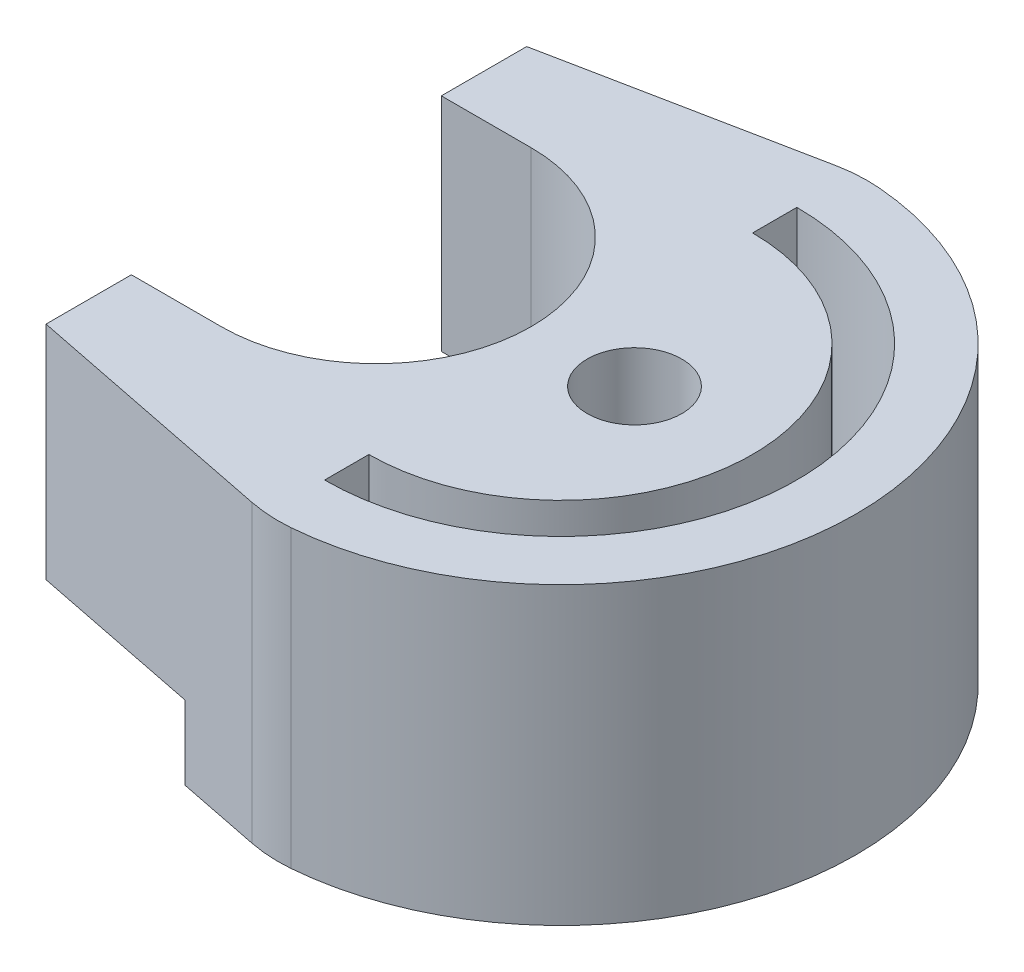
ISO-10303-21;
HEADER;
FILE_DESCRIPTION(('STEP AP214'),'2;1');
FILE_NAME('part.step','',(''),(''),'','','');
FILE_SCHEMA(('AUTOMOTIVE_DESIGN { 1 0 10303 214 1 1 1 1 }'));
ENDSEC;
DATA;
#1=APPLICATION_CONTEXT('core data for automotive mechanical design processes');
#2=APPLICATION_PROTOCOL_DEFINITION('international standard','automotive_design',2000,#1);
#3=PRODUCT_CONTEXT('',#1,'mechanical');
#4=PRODUCT('Part','Part','',(#3));
#5=PRODUCT_RELATED_PRODUCT_CATEGORY('part','',(#4));
#6=PRODUCT_DEFINITION_FORMATION('','',#4);
#7=PRODUCT_DEFINITION_CONTEXT('part definition',#1,'design');
#8=PRODUCT_DEFINITION('design','',#6,#7);
#9=PRODUCT_DEFINITION_SHAPE('','',#8);
#10=(LENGTH_UNIT() NAMED_UNIT(*) SI_UNIT(.MILLI.,.METRE.));
#11=(NAMED_UNIT(*) PLANE_ANGLE_UNIT() SI_UNIT($,.RADIAN.));
#12=(NAMED_UNIT(*) SI_UNIT($,.STERADIAN.) SOLID_ANGLE_UNIT());
#13=UNCERTAINTY_MEASURE_WITH_UNIT(LENGTH_MEASURE(1.E-05),#10,'distance_accuracy_value','');
#14=(GEOMETRIC_REPRESENTATION_CONTEXT(3) GLOBAL_UNCERTAINTY_ASSIGNED_CONTEXT((#13)) GLOBAL_UNIT_ASSIGNED_CONTEXT((#10,
#11,#12)) REPRESENTATION_CONTEXT('',''));
#15=CARTESIAN_POINT('',(0.,0.,0.));
#16=DIRECTION('',(0.,0.,1.));
#17=DIRECTION('',(1.,0.,0.));
#18=AXIS2_PLACEMENT_3D('',#15,#16,#17);
#19=CARTESIAN_POINT('',(-0.681941879985558,2.,0.));
#20=DIRECTION('',(-1.,0.,0.));
#21=DIRECTION('',(0.,0.,1.));
#22=AXIS2_PLACEMENT_3D('',#19,#20,#21);
#23=PLANE('',#22);
#24=DIRECTION('',(0.,-1.,0.));
#25=VECTOR('',#24,1.);
#26=CARTESIAN_POINT('',(-0.681941879985558,2.,-1.11346754433403));
#27=LINE('',#26,#25);
#28=CARTESIAN_POINT('',(-0.681941879985558,0.5,-1.11346754433403));
#29=VERTEX_POINT('',#28);
#30=CARTESIAN_POINT('',(-0.681941879985558,0.,-1.11346754433403));
#31=VERTEX_POINT('',#30);
#32=EDGE_CURVE('E303',#29,#31,#27,.T.);
#33=ORIENTED_EDGE('',*,*,#32,.F.);
#34=DIRECTION('',(0.,0.,1.));
#35=VECTOR('',#34,1.);
#36=CARTESIAN_POINT('',(-0.681941879985558,0.5,0.));
#37=LINE('',#36,#35);
#38=CARTESIAN_POINT('',(-0.681941879985558,0.5,-1.86374319751422));
#39=VERTEX_POINT('',#38);
#40=EDGE_CURVE('E54',#39,#29,#37,.T.);
#41=ORIENTED_EDGE('',*,*,#40,.F.);
#42=DIRECTION('',(0.,-1.,0.));
#43=VECTOR('',#42,1.);
#44=CARTESIAN_POINT('',(-0.681941879985558,2.,-1.86374319751422));
#45=LINE('',#44,#43);
#46=CARTESIAN_POINT('',(-0.681941879985558,0.,-1.86374319751422));
#47=VERTEX_POINT('',#46);
#48=EDGE_CURVE('E305',#39,#47,#45,.T.);
#49=ORIENTED_EDGE('',*,*,#48,.T.);
#50=DIRECTION('',(0.,0.,-1.));
#51=VECTOR('',#50,1.);
#52=CARTESIAN_POINT('',(-0.681941879985558,0.,0.));
#53=LINE('',#52,#51);
#54=EDGE_CURVE('E281',#31,#47,#53,.T.);
#55=ORIENTED_EDGE('',*,*,#54,.F.);
#56=EDGE_LOOP('',(#33,#41,#49,#55));
#57=FACE_BOUND('',#56,.T.);
#58=ADVANCED_FACE('F37',(#57),#23,.T.);
#59=CARTESIAN_POINT('',(-1.24999999999968,2.,0.));
#60=DIRECTION('',(0.,-1.,0.));
#61=DIRECTION('',(0.,0.,-1.));
#62=AXIS2_PLACEMENT_3D('',#59,#60,#61);
#63=CYLINDRICAL_SURFACE('',#62,1.24999999999969);
#64=DIRECTION('',(0.,-1.,0.));
#65=VECTOR('',#64,1.);
#66=CARTESIAN_POINT('',(-0.681941879985558,2.,1.11346754433402));
#67=LINE('',#66,#65);
#68=CARTESIAN_POINT('',(-0.681941879985558,0.5,1.11346754433402));
#69=VERTEX_POINT('',#68);
#70=CARTESIAN_POINT('',(-0.681941879985558,0.,1.11346754433402));
#71=VERTEX_POINT('',#70);
#72=EDGE_CURVE('E301',#69,#71,#67,.T.);
#73=ORIENTED_EDGE('',*,*,#72,.F.);
#74=CARTESIAN_POINT('',(-1.24999999999968,0.5,0.));
#75=DIRECTION('',(0.,1.,0.));
#76=DIRECTION('',(0.,0.,1.));
#77=AXIS2_PLACEMENT_3D('',#74,#75,#76);
#78=CIRCLE('',#77,1.24999999999969);
#79=EDGE_CURVE('E62',#69,#29,#78,.T.);
#80=ORIENTED_EDGE('',*,*,#79,.T.);
#81=ORIENTED_EDGE('',*,*,#32,.T.);
#82=CARTESIAN_POINT('',(-1.24999999999968,0.,0.));
#83=DIRECTION('',(0.,1.,0.));
#84=DIRECTION('',(0.,0.,1.));
#85=AXIS2_PLACEMENT_3D('',#82,#83,#84);
#86=CIRCLE('',#85,1.24999999999969);
#87=EDGE_CURVE('E284',#71,#31,#86,.T.);
#88=ORIENTED_EDGE('',*,*,#87,.F.);
#89=EDGE_LOOP('',(#73,#80,#81,#88));
#90=FACE_BOUND('',#89,.T.);
#91=ADVANCED_FACE('F362',(#90),#63,.F.);
#92=CARTESIAN_POINT('',(-0.681941879985558,2.,0.));
#93=DIRECTION('',(-1.,0.,0.));
#94=DIRECTION('',(0.,0.,1.));
#95=AXIS2_PLACEMENT_3D('',#92,#93,#94);
#96=PLANE('',#95);
#97=DIRECTION('',(0.,-1.,0.));
#98=VECTOR('',#97,1.);
#99=CARTESIAN_POINT('',(-0.681941879985558,2.,1.86374319742319));
#100=LINE('',#99,#98);
#101=CARTESIAN_POINT('',(-0.681941879985558,0.5,1.86374319742319));
#102=VERTEX_POINT('',#101);
#103=CARTESIAN_POINT('',(-0.681941879985558,0.,1.86374319742319));
#104=VERTEX_POINT('',#103);
#105=EDGE_CURVE('E299',#102,#104,#100,.T.);
#106=ORIENTED_EDGE('',*,*,#105,.F.);
#107=DIRECTION('',(0.,0.,1.));
#108=VECTOR('',#107,1.);
#109=CARTESIAN_POINT('',(-0.681941879985558,0.5,0.));
#110=LINE('',#109,#108);
#111=EDGE_CURVE('E209',#69,#102,#110,.T.);
#112=ORIENTED_EDGE('',*,*,#111,.F.);
#113=ORIENTED_EDGE('',*,*,#72,.T.);
#114=DIRECTION('',(0.,0.,-1.));
#115=VECTOR('',#114,1.);
#116=CARTESIAN_POINT('',(-0.681941879985558,0.,0.));
#117=LINE('',#116,#115);
#118=EDGE_CURVE('E287',#104,#71,#117,.T.);
#119=ORIENTED_EDGE('',*,*,#118,.F.);
#120=EDGE_LOOP('',(#106,#112,#113,#119));
#121=FACE_BOUND('',#120,.T.);
#122=ADVANCED_FACE('F361',(#121),#96,.T.);
#123=CARTESIAN_POINT('',(-2.07258879112923E-10,2.,-1.12353734090793E-10));
#124=DIRECTION('',(0.,-1.,0.));
#125=DIRECTION('',(0.,0.,-1.));
#126=AXIS2_PLACEMENT_3D('',#123,#124,#125);
#127=CYLINDRICAL_SURFACE('',#126,2.00000000012898);
#128=CARTESIAN_POINT('',(-2.07258879112923E-10,0.,-1.12353734090793E-10));
#129=DIRECTION('',(0.,1.,0.));
#130=DIRECTION('',(0.,0.,1.));
#131=AXIS2_PLACEMENT_3D('',#128,#129,#130);
#132=CIRCLE('',#131,2.00000000012898);
#133=CARTESIAN_POINT('',(0.164100898676437,0.,-1.9932563547997));
#134=VERTEX_POINT('',#133);
#135=CARTESIAN_POINT('',(0.1641008983742,0.,1.99325635459988));
#136=VERTEX_POINT('',#135);
#137=EDGE_CURVE('E273',#134,#136,#132,.F.);
#138=ORIENTED_EDGE('',*,*,#137,.F.);
#139=DIRECTION('',(0.,-1.,0.));
#140=VECTOR('',#139,1.);
#141=CARTESIAN_POINT('',(0.164100898676437,2.,-1.9932563547997));
#142=LINE('',#141,#140);
#143=CARTESIAN_POINT('',(0.164100898676437,2.,-1.9932563547997));
#144=VERTEX_POINT('',#143);
#145=EDGE_CURVE('E11',#144,#134,#142,.T.);
#146=ORIENTED_EDGE('',*,*,#145,.F.);
#147=CARTESIAN_POINT('',(-2.07258879112923E-10,2.,-1.12353734090793E-10));
#148=DIRECTION('',(0.,1.,0.));
#149=DIRECTION('',(0.,0.,1.));
#150=AXIS2_PLACEMENT_3D('',#147,#148,#149);
#151=CIRCLE('',#150,2.00000000012898);
#152=CARTESIAN_POINT('',(0.1641008983742,2.,1.99325635459988));
#153=VERTEX_POINT('',#152);
#154=EDGE_CURVE('E251',#144,#153,#151,.F.);
#155=ORIENTED_EDGE('',*,*,#154,.T.);
#156=DIRECTION('',(0.,-1.,0.));
#157=VECTOR('',#156,1.);
#158=CARTESIAN_POINT('',(0.1641008983742,2.,1.99325635459988));
#159=LINE('',#158,#157);
#160=EDGE_CURVE('E295',#153,#136,#159,.T.);
#161=ORIENTED_EDGE('',*,*,#160,.T.);
#162=EDGE_LOOP('',(#138,#146,#155,#161));
#163=FACE_BOUND('',#162,.T.);
#164=ADVANCED_FACE('F350',(#163),#127,.T.);
#165=CARTESIAN_POINT('',(0.0820504492398807,2.,-0.9966281775203));
#166=DIRECTION('',(0.,-1.,0.));
#167=DIRECTION('',(0.,0.,-1.));
#168=AXIS2_PLACEMENT_3D('',#165,#166,#167);
#169=CYLINDRICAL_SURFACE('',#168,1.);
#170=CARTESIAN_POINT('',(0.0820504492398807,0.,-0.9966281775203));
#171=DIRECTION('',(0.,1.,0.));
#172=DIRECTION('',(0.,0.,1.));
#173=AXIS2_PLACEMENT_3D('',#170,#171,#172);
#174=CIRCLE('',#173,1.);
#175=CARTESIAN_POINT('',(-0.113883759971435,0.,-1.97724522084595));
#176=VERTEX_POINT('',#175);
#177=EDGE_CURVE('E276',#134,#176,#174,.T.);
#178=ORIENTED_EDGE('',*,*,#177,.T.);
#179=DIRECTION('',(0.,-1.,0.));
#180=VECTOR('',#179,1.);
#181=CARTESIAN_POINT('',(-0.113883759971435,2.,-1.97724522084595));
#182=LINE('',#181,#180);
#183=CARTESIAN_POINT('',(-0.113883759971435,2.,-1.97724522084595));
#184=VERTEX_POINT('',#183);
#185=EDGE_CURVE('E46',#184,#176,#182,.T.);
#186=ORIENTED_EDGE('',*,*,#185,.F.);
#187=CARTESIAN_POINT('',(0.0820504492398807,2.,-0.9966281775203));
#188=DIRECTION('',(0.,1.,0.));
#189=DIRECTION('',(0.,0.,1.));
#190=AXIS2_PLACEMENT_3D('',#187,#188,#189);
#191=CIRCLE('',#190,1.);
#192=EDGE_CURVE('E173',#144,#184,#191,.T.);
#193=ORIENTED_EDGE('',*,*,#192,.F.);
#194=ORIENTED_EDGE('',*,*,#145,.T.);
#195=EDGE_LOOP('',(#178,#186,#193,#194));
#196=FACE_BOUND('',#195,.T.);
#197=ADVANCED_FACE('F365',(#196),#169,.T.);
#198=CARTESIAN_POINT('',(-0.384272849884788,2.,-1.92321957151411));
#199=DIRECTION('',(0.195934209211316,0.,0.980617043325648));
#200=DIRECTION('',(0.980617043325648,0.,-0.195934209211316));
#201=AXIS2_PLACEMENT_3D('',#198,#199,#200);
#202=PLANE('',#201);
#203=DIRECTION('',(-0.980617043325648,0.,0.195934209211316));
#204=VECTOR('',#203,1.);
#205=CARTESIAN_POINT('',(-0.384272849884788,0.,-1.92321957151411));
#206=LINE('',#205,#204);
#207=EDGE_CURVE('E279',#176,#47,#206,.T.);
#208=ORIENTED_EDGE('',*,*,#207,.T.);
#209=ORIENTED_EDGE('',*,*,#48,.F.);
#210=DIRECTION('',(-0.980617043325648,0.,0.195934209211316));
#211=VECTOR('',#210,1.);
#212=CARTESIAN_POINT('',(-0.384272849884788,0.5,-1.92321957151411));
#213=LINE('',#212,#211);
#214=CARTESIAN_POINT('',(-1.85903885005184,0.5,-1.62855091163185));
#215=VERTEX_POINT('',#214);
#216=EDGE_CURVE('E184',#39,#215,#213,.T.);
#217=ORIENTED_EDGE('',*,*,#216,.T.);
#218=DIRECTION('',(0.,-1.,0.));
#219=VECTOR('',#218,1.);
#220=CARTESIAN_POINT('',(-1.85903885005184,2.,-1.62855091163185));
#221=LINE('',#220,#219);
#222=CARTESIAN_POINT('',(-1.85903885005184,2.,-1.62855091163185));
#223=VERTEX_POINT('',#222);
#224=EDGE_CURVE('E180',#223,#215,#221,.T.);
#225=ORIENTED_EDGE('',*,*,#224,.F.);
#226=DIRECTION('',(-0.980617043325648,0.,0.195934209211316));
#227=VECTOR('',#226,1.);
#228=CARTESIAN_POINT('',(-0.384272849884788,2.,-1.92321957151411));
#229=LINE('',#228,#227);
#230=EDGE_CURVE('E164',#184,#223,#229,.T.);
#231=ORIENTED_EDGE('',*,*,#230,.F.);
#232=ORIENTED_EDGE('',*,*,#185,.T.);
#233=EDGE_LOOP('',(#208,#209,#217,#225,#231,#232));
#234=FACE_BOUND('',#233,.T.);
#235=ADVANCED_FACE('F182',(#234),#202,.F.);
#236=CARTESIAN_POINT('',(-0.384272849561752,2.,1.92321957143991));
#237=DIRECTION('',(-0.195934209060197,0.,0.980617043355843));
#238=DIRECTION('',(0.980617043355843,0.,0.195934209060197));
#239=AXIS2_PLACEMENT_3D('',#236,#237,#238);
#240=PLANE('',#239);
#241=DIRECTION('',(-0.980617043355843,0.,-0.195934209060197));
#242=VECTOR('',#241,1.);
#243=CARTESIAN_POINT('',(-0.384272849561752,0.,1.92321957143991));
#244=LINE('',#243,#242);
#245=CARTESIAN_POINT('',(-0.113883759971435,0.,1.97724522066388));
#246=VERTEX_POINT('',#245);
#247=EDGE_CURVE('E290',#246,#104,#244,.T.);
#248=ORIENTED_EDGE('',*,*,#247,.F.);
#249=DIRECTION('',(0.,-1.,0.));
#250=VECTOR('',#249,1.);
#251=CARTESIAN_POINT('',(-0.113883759971435,2.,1.97724522066388));
#252=LINE('',#251,#250);
#253=CARTESIAN_POINT('',(-0.113883759971435,2.,1.97724522066388));
#254=VERTEX_POINT('',#253);
#255=EDGE_CURVE('E297',#254,#246,#252,.T.);
#256=ORIENTED_EDGE('',*,*,#255,.F.);
#257=DIRECTION('',(-0.980617043355843,0.,-0.195934209060197));
#258=VECTOR('',#257,1.);
#259=CARTESIAN_POINT('',(-0.384272849561752,2.,1.92321957143991));
#260=LINE('',#259,#258);
#261=CARTESIAN_POINT('',(-1.85903885005184,2.,1.62855091172946));
#262=VERTEX_POINT('',#261);
#263=EDGE_CURVE('E177',#254,#262,#260,.T.);
#264=ORIENTED_EDGE('',*,*,#263,.T.);
#265=DIRECTION('',(0.,-1.,0.));
#266=VECTOR('',#265,1.);
#267=CARTESIAN_POINT('',(-1.85903885005184,2.,1.62855091172946));
#268=LINE('',#267,#266);
#269=CARTESIAN_POINT('',(-1.85903885005184,0.5,1.62855091172946));
#270=VERTEX_POINT('',#269);
#271=EDGE_CURVE('E208',#262,#270,#268,.T.);
#272=ORIENTED_EDGE('',*,*,#271,.T.);
#273=DIRECTION('',(-0.980617043355843,0.,-0.195934209060197));
#274=VECTOR('',#273,1.);
#275=CARTESIAN_POINT('',(-0.384272849561752,0.5,1.92321957143991));
#276=LINE('',#275,#274);
#277=EDGE_CURVE('E193',#102,#270,#276,.T.);
#278=ORIENTED_EDGE('',*,*,#277,.F.);
#279=ORIENTED_EDGE('',*,*,#105,.T.);
#280=EDGE_LOOP('',(#248,#256,#264,#272,#278,#279));
#281=FACE_BOUND('',#280,.T.);
#282=ADVANCED_FACE('F356',(#281),#240,.T.);
#283=CARTESIAN_POINT('',(-2.07258879112923E-10,2.,-1.12353734090793E-10));
#284=DIRECTION('',(0.,-1.,0.));
#285=DIRECTION('',(0.,0.,-1.));
#286=AXIS2_PLACEMENT_3D('',#283,#284,#285);
#287=CYLINDRICAL_SURFACE('',#286,1.3);
#288=CARTESIAN_POINT('',(-2.07258879112923E-10,0.,-1.12353734090793E-10));
#289=DIRECTION('',(0.,1.,0.));
#290=DIRECTION('',(0.,0.,1.));
#291=AXIS2_PLACEMENT_3D('',#288,#289,#290);
#292=CIRCLE('',#291,1.3);
#293=CARTESIAN_POINT('',(-2.07258996206758E-10,0.,-1.30000000011235));
#294=VERTEX_POINT('',#293);
#295=CARTESIAN_POINT('',(-2.07258932560699E-10,0.,1.29999999988765));
#296=VERTEX_POINT('',#295);
#297=EDGE_CURVE('E188',#294,#296,#292,.F.);
#298=ORIENTED_EDGE('',*,*,#297,.F.);
#299=DIRECTION('',(0.,-1.,0.));
#300=VECTOR('',#299,1.);
#301=CARTESIAN_POINT('',(-2.07258996206758E-10,2.,-1.30000000011235));
#302=LINE('',#301,#300);
#303=CARTESIAN_POINT('',(-2.07258996206758E-10,2.,-1.30000000011235));
#304=VERTEX_POINT('',#303);
#305=EDGE_CURVE('E41',#304,#294,#302,.T.);
#306=ORIENTED_EDGE('',*,*,#305,.F.);
#307=CARTESIAN_POINT('',(-2.07258879112923E-10,2.,-1.12353734090793E-10));
#308=DIRECTION('',(0.,1.,0.));
#309=DIRECTION('',(0.,0.,1.));
#310=AXIS2_PLACEMENT_3D('',#307,#308,#309);
#311=CIRCLE('',#310,1.3);
#312=CARTESIAN_POINT('',(-2.07258932560699E-10,2.,1.29999999988765));
#313=VERTEX_POINT('',#312);
#314=EDGE_CURVE('E236',#304,#313,#311,.F.);
#315=ORIENTED_EDGE('',*,*,#314,.T.);
#316=DIRECTION('',(0.,-1.,0.));
#317=VECTOR('',#316,1.);
#318=CARTESIAN_POINT('',(-2.07258932560699E-10,2.,1.29999999988765));
#319=LINE('',#318,#317);
#320=EDGE_CURVE('E258',#313,#296,#319,.T.);
#321=ORIENTED_EDGE('',*,*,#320,.T.);
#322=EDGE_LOOP('',(#298,#306,#315,#321));
#323=FACE_BOUND('',#322,.T.);
#324=ADVANCED_FACE('F39',(#323),#287,.T.);
#325=CARTESIAN_POINT('',(-2.07258837002674E-10,2.,0.));
#326=DIRECTION('',(1.,0.,0.));
#327=DIRECTION('',(0.,0.,-1.));
#328=AXIS2_PLACEMENT_3D('',#325,#326,#327);
#329=PLANE('',#328);
#330=DIRECTION('',(0.,0.,1.));
#331=VECTOR('',#330,1.);
#332=CARTESIAN_POINT('',(-2.07258837002674E-10,0.,0.));
#333=LINE('',#332,#331);
#334=CARTESIAN_POINT('',(-2.07259032946162E-10,0.,-1.60000000011235));
#335=VERTEX_POINT('',#334);
#336=EDGE_CURVE('E261',#335,#294,#333,.T.);
#337=ORIENTED_EDGE('',*,*,#336,.F.);
#338=DIRECTION('',(0.,-1.,0.));
#339=VECTOR('',#338,1.);
#340=CARTESIAN_POINT('',(-2.07259032946162E-10,2.,-1.60000000011235));
#341=LINE('',#340,#339);
#342=CARTESIAN_POINT('',(-2.07259032946162E-10,2.,-1.60000000011235));
#343=VERTEX_POINT('',#342);
#344=EDGE_CURVE('E310',#343,#335,#341,.T.);
#345=ORIENTED_EDGE('',*,*,#344,.F.);
#346=DIRECTION('',(0.,0.,1.));
#347=VECTOR('',#346,1.);
#348=CARTESIAN_POINT('',(-2.07258837002674E-10,2.,0.));
#349=LINE('',#348,#347);
#350=EDGE_CURVE('E239',#343,#304,#349,.T.);
#351=ORIENTED_EDGE('',*,*,#350,.T.);
#352=ORIENTED_EDGE('',*,*,#305,.T.);
#353=EDGE_LOOP('',(#337,#345,#351,#352));
#354=FACE_BOUND('',#353,.T.);
#355=ADVANCED_FACE('F317',(#354),#329,.T.);
#356=CARTESIAN_POINT('',(-2.07258879112923E-10,2.,-1.12353734090793E-10));
#357=DIRECTION('',(0.,-1.,0.));
#358=DIRECTION('',(0.,0.,-1.));
#359=AXIS2_PLACEMENT_3D('',#356,#357,#358);
#360=CYLINDRICAL_SURFACE('',#359,1.6);
#361=CARTESIAN_POINT('',(-2.07258879112923E-10,0.,-1.12353734090793E-10));
#362=DIRECTION('',(0.,1.,0.));
#363=DIRECTION('',(0.,0.,1.));
#364=AXIS2_PLACEMENT_3D('',#361,#362,#363);
#365=CIRCLE('',#364,1.6);
#366=CARTESIAN_POINT('',(-2.07258895821295E-10,0.,1.59999999988765));
#367=VERTEX_POINT('',#366);
#368=EDGE_CURVE('E264',#335,#367,#365,.F.);
#369=ORIENTED_EDGE('',*,*,#368,.T.);
#370=DIRECTION('',(0.,-1.,0.));
#371=VECTOR('',#370,1.);
#372=CARTESIAN_POINT('',(-2.07258895821295E-10,2.,1.59999999988765));
#373=LINE('',#372,#371);
#374=CARTESIAN_POINT('',(-2.07258895821295E-10,2.,1.59999999988765));
#375=VERTEX_POINT('',#374);
#376=EDGE_CURVE('E309',#375,#367,#373,.T.);
#377=ORIENTED_EDGE('',*,*,#376,.F.);
#378=CARTESIAN_POINT('',(-2.07258879112923E-10,2.,-1.12353734090793E-10));
#379=DIRECTION('',(0.,1.,0.));
#380=DIRECTION('',(0.,0.,1.));
#381=AXIS2_PLACEMENT_3D('',#378,#379,#380);
#382=CIRCLE('',#381,1.6);
#383=EDGE_CURVE('E243',#343,#375,#382,.F.);
#384=ORIENTED_EDGE('',*,*,#383,.F.);
#385=ORIENTED_EDGE('',*,*,#344,.T.);
#386=EDGE_LOOP('',(#369,#377,#384,#385));
#387=FACE_BOUND('',#386,.T.);
#388=ADVANCED_FACE('F326',(#387),#360,.F.);
#389=CARTESIAN_POINT('',(0.5,2.,0.));
#390=DIRECTION('',(0.,-1.,0.));
#391=DIRECTION('',(0.,0.,-1.));
#392=AXIS2_PLACEMENT_3D('',#389,#390,#391);
#393=CYLINDRICAL_SURFACE('',#392,0.3207);
#394=CARTESIAN_POINT('',(0.5,2.,0.));
#395=DIRECTION('',(0.,1.,0.));
#396=DIRECTION('',(0.,0.,1.));
#397=AXIS2_PLACEMENT_3D('',#394,#395,#396);
#398=CIRCLE('',#397,0.3207);
#399=CARTESIAN_POINT('',(0.5,2.,0.3207));
#400=VERTEX_POINT('',#399);
#401=EDGE_CURVE('E248',#400,#400,#398,.T.);
#402=ORIENTED_EDGE('',*,*,#401,.T.);
#403=EDGE_LOOP('',(#402));
#404=FACE_BOUND('',#403,.T.);
#405=CARTESIAN_POINT('',(0.5,0.,0.));
#406=DIRECTION('',(0.,1.,0.));
#407=DIRECTION('',(0.,0.,1.));
#408=AXIS2_PLACEMENT_3D('',#405,#406,#407);
#409=CIRCLE('',#408,0.3207);
#410=CARTESIAN_POINT('',(0.5,0.,0.3207));
#411=VERTEX_POINT('',#410);
#412=EDGE_CURVE('E270',#411,#411,#409,.T.);
#413=ORIENTED_EDGE('',*,*,#412,.F.);
#414=EDGE_LOOP('',(#413));
#415=FACE_BOUND('',#414,.T.);
#416=ADVANCED_FACE('F337',(#404,#415),#393,.F.);
#417=CARTESIAN_POINT('',(-2.07259091764783E-10,2.,0.));
#418=DIRECTION('',(1.,0.,0.));
#419=DIRECTION('',(0.,0.,-1.));
#420=AXIS2_PLACEMENT_3D('',#417,#418,#419);
#421=PLANE('',#420);
#422=DIRECTION('',(0.,0.,1.));
#423=VECTOR('',#422,1.);
#424=CARTESIAN_POINT('',(-2.07259091764783E-10,0.,0.));
#425=LINE('',#424,#423);
#426=EDGE_CURVE('E267',#296,#367,#425,.T.);
#427=ORIENTED_EDGE('',*,*,#426,.F.);
#428=ORIENTED_EDGE('',*,*,#320,.F.);
#429=DIRECTION('',(0.,0.,1.));
#430=VECTOR('',#429,1.);
#431=CARTESIAN_POINT('',(-2.07259091764783E-10,2.,0.));
#432=LINE('',#431,#430);
#433=EDGE_CURVE('E245',#313,#375,#432,.T.);
#434=ORIENTED_EDGE('',*,*,#433,.T.);
#435=ORIENTED_EDGE('',*,*,#376,.T.);
#436=EDGE_LOOP('',(#427,#428,#434,#435));
#437=FACE_BOUND('',#436,.T.);
#438=ADVANCED_FACE('F329',(#437),#421,.T.);
#439=CARTESIAN_POINT('',(0.0820504490887623,2.,0.996628177308034));
#440=DIRECTION('',(0.,-1.,0.));
#441=DIRECTION('',(0.,0.,-1.));
#442=AXIS2_PLACEMENT_3D('',#439,#440,#441);
#443=CYLINDRICAL_SURFACE('',#442,1.);
#444=CARTESIAN_POINT('',(0.0820504490887623,0.,0.996628177308034));
#445=DIRECTION('',(0.,1.,0.));
#446=DIRECTION('',(0.,0.,1.));
#447=AXIS2_PLACEMENT_3D('',#444,#445,#446);
#448=CIRCLE('',#447,1.);
#449=EDGE_CURVE('E240',#246,#136,#448,.T.);
#450=ORIENTED_EDGE('',*,*,#449,.T.);
#451=ORIENTED_EDGE('',*,*,#160,.F.);
#452=CARTESIAN_POINT('',(0.0820504490887623,2.,0.996628177308034));
#453=DIRECTION('',(0.,1.,0.));
#454=DIRECTION('',(0.,0.,1.));
#455=AXIS2_PLACEMENT_3D('',#452,#453,#454);
#456=CIRCLE('',#455,1.);
#457=EDGE_CURVE('E256',#254,#153,#456,.T.);
#458=ORIENTED_EDGE('',*,*,#457,.F.);
#459=ORIENTED_EDGE('',*,*,#255,.T.);
#460=EDGE_LOOP('',(#450,#451,#458,#459));
#461=FACE_BOUND('',#460,.T.);
#462=ADVANCED_FACE('F333',(#461),#443,.T.);
#463=CARTESIAN_POINT('',(0.,2.,0.));
#464=DIRECTION('',(0.,1.,0.));
#465=DIRECTION('',(0.,0.,1.));
#466=AXIS2_PLACEMENT_3D('',#463,#464,#465);
#467=PLANE('',#466);
#468=ORIENTED_EDGE('',*,*,#314,.F.);
#469=ORIENTED_EDGE('',*,*,#350,.F.);
#470=ORIENTED_EDGE('',*,*,#383,.T.);
#471=ORIENTED_EDGE('',*,*,#433,.F.);
#472=EDGE_LOOP('',(#468,#469,#470,#471));
#473=FACE_BOUND('',#472,.T.);
#474=ORIENTED_EDGE('',*,*,#401,.F.);
#475=EDGE_LOOP('',(#474));
#476=FACE_BOUND('',#475,.T.);
#477=ORIENTED_EDGE('',*,*,#154,.F.);
#478=ORIENTED_EDGE('',*,*,#192,.T.);
#479=ORIENTED_EDGE('',*,*,#230,.T.);
#480=DIRECTION('',(0.,0.,-1.));
#481=VECTOR('',#480,1.);
#482=CARTESIAN_POINT('',(-1.85903885005184,2.,0.));
#483=LINE('',#482,#481);
#484=CARTESIAN_POINT('',(-1.85903885005184,2.,-1.0499999999997));
#485=VERTEX_POINT('',#484);
#486=EDGE_CURVE('E170',#485,#223,#483,.T.);
#487=ORIENTED_EDGE('',*,*,#486,.F.);
#488=DIRECTION('',(-1.,0.,0.));
#489=VECTOR('',#488,1.);
#490=CARTESIAN_POINT('',(0.,2.,-1.0499999999997));
#491=LINE('',#490,#489);
#492=CARTESIAN_POINT('',(-1.24999999999968,2.,-1.0499999999997));
#493=VERTEX_POINT('',#492);
#494=EDGE_CURVE('E192',#493,#485,#491,.T.);
#495=ORIENTED_EDGE('',*,*,#494,.F.);
#496=CARTESIAN_POINT('',(-1.24999999999968,2.,0.));
#497=DIRECTION('',(0.,1.,0.));
#498=DIRECTION('',(0.,0.,1.));
#499=AXIS2_PLACEMENT_3D('',#496,#497,#498);
#500=CIRCLE('',#499,1.04999999999969);
#501=CARTESIAN_POINT('',(-1.24999999999968,2.,1.04999999999969));
#502=VERTEX_POINT('',#501);
#503=EDGE_CURVE('E195',#502,#493,#500,.T.);
#504=ORIENTED_EDGE('',*,*,#503,.F.);
#505=DIRECTION('',(-1.,0.,0.));
#506=VECTOR('',#505,1.);
#507=CARTESIAN_POINT('',(0.,2.,1.04999999999969));
#508=LINE('',#507,#506);
#509=CARTESIAN_POINT('',(-1.85903885005184,2.,1.04999999999969));
#510=VERTEX_POINT('',#509);
#511=EDGE_CURVE('E203',#502,#510,#508,.T.);
#512=ORIENTED_EDGE('',*,*,#511,.T.);
#513=DIRECTION('',(0.,0.,1.));
#514=VECTOR('',#513,1.);
#515=CARTESIAN_POINT('',(-1.85903885005184,2.,0.));
#516=LINE('',#515,#514);
#517=EDGE_CURVE('E205',#510,#262,#516,.T.);
#518=ORIENTED_EDGE('',*,*,#517,.T.);
#519=ORIENTED_EDGE('',*,*,#263,.F.);
#520=ORIENTED_EDGE('',*,*,#457,.T.);
#521=EDGE_LOOP('',(#477,#478,#479,#487,#495,#504,#512,#518,#519,#520));
#522=FACE_BOUND('',#521,.T.);
#523=ADVANCED_FACE('F167',(#473,#476,#522),#467,.T.);
#524=CARTESIAN_POINT('',(0.,0.,0.));
#525=DIRECTION('',(0.,1.,0.));
#526=DIRECTION('',(0.,0.,1.));
#527=AXIS2_PLACEMENT_3D('',#524,#525,#526);
#528=PLANE('',#527);
#529=ORIENTED_EDGE('',*,*,#297,.T.);
#530=ORIENTED_EDGE('',*,*,#426,.T.);
#531=ORIENTED_EDGE('',*,*,#368,.F.);
#532=ORIENTED_EDGE('',*,*,#336,.T.);
#533=EDGE_LOOP('',(#529,#530,#531,#532));
#534=FACE_BOUND('',#533,.T.);
#535=ORIENTED_EDGE('',*,*,#412,.T.);
#536=EDGE_LOOP('',(#535));
#537=FACE_BOUND('',#536,.T.);
#538=ORIENTED_EDGE('',*,*,#137,.T.);
#539=ORIENTED_EDGE('',*,*,#449,.F.);
#540=ORIENTED_EDGE('',*,*,#247,.T.);
#541=ORIENTED_EDGE('',*,*,#118,.T.);
#542=ORIENTED_EDGE('',*,*,#87,.T.);
#543=ORIENTED_EDGE('',*,*,#54,.T.);
#544=ORIENTED_EDGE('',*,*,#207,.F.);
#545=ORIENTED_EDGE('',*,*,#177,.F.);
#546=EDGE_LOOP('',(#538,#539,#540,#541,#542,#543,#544,#545));
#547=FACE_BOUND('',#546,.T.);
#548=ADVANCED_FACE('F323',(#534,#537,#547),#528,.F.);
#549=CARTESIAN_POINT('',(-1.85903885005184,2.,0.));
#550=DIRECTION('',(-1.,0.,0.));
#551=DIRECTION('',(0.,0.,1.));
#552=AXIS2_PLACEMENT_3D('',#549,#550,#551);
#553=PLANE('',#552);
#554=DIRECTION('',(0.,0.,-1.));
#555=VECTOR('',#554,1.);
#556=CARTESIAN_POINT('',(-1.85903885005184,0.5,0.));
#557=LINE('',#556,#555);
#558=CARTESIAN_POINT('',(-1.85903885005184,0.5,-1.0499999999997));
#559=VERTEX_POINT('',#558);
#560=EDGE_CURVE('E215',#559,#215,#557,.T.);
#561=ORIENTED_EDGE('',*,*,#560,.F.);
#562=DIRECTION('',(0.,-1.,0.));
#563=VECTOR('',#562,1.);
#564=CARTESIAN_POINT('',(-1.85903885005184,2.,-1.0499999999997));
#565=LINE('',#564,#563);
#566=EDGE_CURVE('E189',#485,#559,#565,.T.);
#567=ORIENTED_EDGE('',*,*,#566,.F.);
#568=ORIENTED_EDGE('',*,*,#486,.T.);
#569=ORIENTED_EDGE('',*,*,#224,.T.);
#570=EDGE_LOOP('',(#561,#567,#568,#569));
#571=FACE_BOUND('',#570,.T.);
#572=ADVANCED_FACE('F191',(#571),#553,.T.);
#573=CARTESIAN_POINT('',(0.,2.,-1.0499999999997));
#574=DIRECTION('',(0.,0.,1.));
#575=DIRECTION('',(1.,0.,0.));
#576=AXIS2_PLACEMENT_3D('',#573,#574,#575);
#577=PLANE('',#576);
#578=DIRECTION('',(-1.,0.,0.));
#579=VECTOR('',#578,1.);
#580=CARTESIAN_POINT('',(0.,0.5,-1.0499999999997));
#581=LINE('',#580,#579);
#582=CARTESIAN_POINT('',(-1.24999999999968,0.5,-1.0499999999997));
#583=VERTEX_POINT('',#582);
#584=EDGE_CURVE('E217',#583,#559,#581,.T.);
#585=ORIENTED_EDGE('',*,*,#584,.F.);
#586=DIRECTION('',(0.,-1.,0.));
#587=VECTOR('',#586,1.);
#588=CARTESIAN_POINT('',(-1.24999999999968,2.,-1.0499999999997));
#589=LINE('',#588,#587);
#590=EDGE_CURVE('E233',#493,#583,#589,.T.);
#591=ORIENTED_EDGE('',*,*,#590,.F.);
#592=ORIENTED_EDGE('',*,*,#494,.T.);
#593=ORIENTED_EDGE('',*,*,#566,.T.);
#594=EDGE_LOOP('',(#585,#591,#592,#593));
#595=FACE_BOUND('',#594,.T.);
#596=ADVANCED_FACE('F380',(#595),#577,.T.);
#597=CARTESIAN_POINT('',(-1.24999999999968,2.,0.));
#598=DIRECTION('',(0.,-1.,0.));
#599=DIRECTION('',(0.,0.,-1.));
#600=AXIS2_PLACEMENT_3D('',#597,#598,#599);
#601=CYLINDRICAL_SURFACE('',#600,1.04999999999969);
#602=CARTESIAN_POINT('',(-1.24999999999968,0.5,0.));
#603=DIRECTION('',(0.,1.,0.));
#604=DIRECTION('',(0.,0.,1.));
#605=AXIS2_PLACEMENT_3D('',#602,#603,#604);
#606=CIRCLE('',#605,1.04999999999969);
#607=CARTESIAN_POINT('',(-1.24999999999968,0.5,1.04999999999969));
#608=VERTEX_POINT('',#607);
#609=EDGE_CURVE('E220',#608,#583,#606,.T.);
#610=ORIENTED_EDGE('',*,*,#609,.F.);
#611=DIRECTION('',(0.,-1.,0.));
#612=VECTOR('',#611,1.);
#613=CARTESIAN_POINT('',(-1.24999999999968,2.,1.04999999999969));
#614=LINE('',#613,#612);
#615=EDGE_CURVE('E231',#502,#608,#614,.T.);
#616=ORIENTED_EDGE('',*,*,#615,.F.);
#617=ORIENTED_EDGE('',*,*,#503,.T.);
#618=ORIENTED_EDGE('',*,*,#590,.T.);
#619=EDGE_LOOP('',(#610,#616,#617,#618));
#620=FACE_BOUND('',#619,.T.);
#621=ADVANCED_FACE('F382',(#620),#601,.F.);
#622=CARTESIAN_POINT('',(0.,2.,1.04999999999969));
#623=DIRECTION('',(0.,0.,1.));
#624=DIRECTION('',(1.,0.,0.));
#625=AXIS2_PLACEMENT_3D('',#622,#623,#624);
#626=PLANE('',#625);
#627=DIRECTION('',(-1.,0.,0.));
#628=VECTOR('',#627,1.);
#629=CARTESIAN_POINT('',(0.,0.5,1.04999999999969));
#630=LINE('',#629,#628);
#631=CARTESIAN_POINT('',(-1.85903885005184,0.5,1.04999999999969));
#632=VERTEX_POINT('',#631);
#633=EDGE_CURVE('E223',#608,#632,#630,.T.);
#634=ORIENTED_EDGE('',*,*,#633,.T.);
#635=DIRECTION('',(0.,-1.,0.));
#636=VECTOR('',#635,1.);
#637=CARTESIAN_POINT('',(-1.85903885005184,2.,1.04999999999969));
#638=LINE('',#637,#636);
#639=EDGE_CURVE('E228',#510,#632,#638,.T.);
#640=ORIENTED_EDGE('',*,*,#639,.F.);
#641=ORIENTED_EDGE('',*,*,#511,.F.);
#642=ORIENTED_EDGE('',*,*,#615,.T.);
#643=EDGE_LOOP('',(#634,#640,#641,#642));
#644=FACE_BOUND('',#643,.T.);
#645=ADVANCED_FACE('F384',(#644),#626,.F.);
#646=CARTESIAN_POINT('',(-1.85903885005184,2.,0.));
#647=DIRECTION('',(1.,0.,0.));
#648=DIRECTION('',(0.,0.,-1.));
#649=AXIS2_PLACEMENT_3D('',#646,#647,#648);
#650=PLANE('',#649);
#651=DIRECTION('',(0.,0.,1.));
#652=VECTOR('',#651,1.);
#653=CARTESIAN_POINT('',(-1.85903885005184,0.5,0.));
#654=LINE('',#653,#652);
#655=EDGE_CURVE('E198',#632,#270,#654,.T.);
#656=ORIENTED_EDGE('',*,*,#655,.T.);
#657=ORIENTED_EDGE('',*,*,#271,.F.);
#658=ORIENTED_EDGE('',*,*,#517,.F.);
#659=ORIENTED_EDGE('',*,*,#639,.T.);
#660=EDGE_LOOP('',(#656,#657,#658,#659));
#661=FACE_BOUND('',#660,.T.);
#662=ADVANCED_FACE('F372',(#661),#650,.F.);
#663=CARTESIAN_POINT('',(0.,0.5,0.));
#664=DIRECTION('',(0.,1.,0.));
#665=DIRECTION('',(0.,0.,1.));
#666=AXIS2_PLACEMENT_3D('',#663,#664,#665);
#667=PLANE('',#666);
#668=ORIENTED_EDGE('',*,*,#111,.T.);
#669=ORIENTED_EDGE('',*,*,#277,.T.);
#670=ORIENTED_EDGE('',*,*,#655,.F.);
#671=ORIENTED_EDGE('',*,*,#633,.F.);
#672=ORIENTED_EDGE('',*,*,#609,.T.);
#673=ORIENTED_EDGE('',*,*,#584,.T.);
#674=ORIENTED_EDGE('',*,*,#560,.T.);
#675=ORIENTED_EDGE('',*,*,#216,.F.);
#676=ORIENTED_EDGE('',*,*,#40,.T.);
#677=ORIENTED_EDGE('',*,*,#79,.F.);
#678=EDGE_LOOP('',(#668,#669,#670,#671,#672,#673,#674,#675,#676,#677));
#679=FACE_BOUND('',#678,.T.);
#680=ADVANCED_FACE('F375',(#679),#667,.F.);
#681=CLOSED_SHELL('',(#58,#91,#122,#164,#197,#235,#282,#324,#355,#388,#416,#438,#462,#523,#548,
#572,#596,#621,#645,#662,#680));
#682=MANIFOLD_SOLID_BREP('B2',#681);
#683=ADVANCED_BREP_SHAPE_REPRESENTATION('',(#18,#682),#14);
#684=SHAPE_DEFINITION_REPRESENTATION(#9,#683);
ENDSEC;
END-ISO-10303-21;
